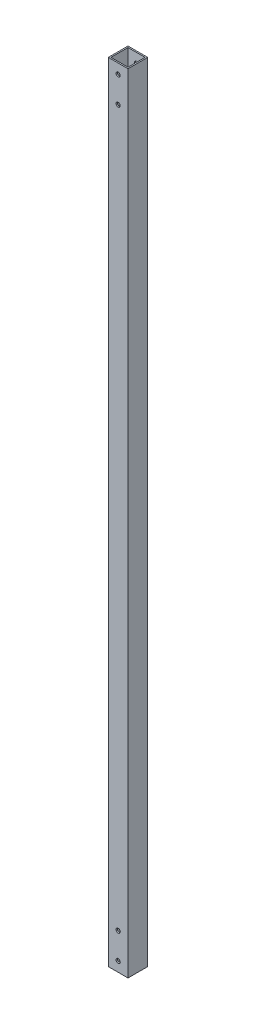
ISO-10303-21;
HEADER;
FILE_DESCRIPTION(('STEP AP214'),'2;1');
FILE_NAME('part.step','',(''),(''),'','','');
FILE_SCHEMA(('AUTOMOTIVE_DESIGN { 1 0 10303 214 1 1 1 1 }'));
ENDSEC;
DATA;
#1=APPLICATION_CONTEXT('core data for automotive mechanical design processes');
#2=APPLICATION_PROTOCOL_DEFINITION('international standard','automotive_design',2000,#1);
#3=PRODUCT_CONTEXT('',#1,'mechanical');
#4=PRODUCT('Part','Part','',(#3));
#5=PRODUCT_RELATED_PRODUCT_CATEGORY('part','',(#4));
#6=PRODUCT_DEFINITION_FORMATION('','',#4);
#7=PRODUCT_DEFINITION_CONTEXT('part definition',#1,'design');
#8=PRODUCT_DEFINITION('design','',#6,#7);
#9=PRODUCT_DEFINITION_SHAPE('','',#8);
#10=(LENGTH_UNIT() NAMED_UNIT(*) SI_UNIT(.MILLI.,.METRE.));
#11=(NAMED_UNIT(*) PLANE_ANGLE_UNIT() SI_UNIT($,.RADIAN.));
#12=(NAMED_UNIT(*) SI_UNIT($,.STERADIAN.) SOLID_ANGLE_UNIT());
#13=UNCERTAINTY_MEASURE_WITH_UNIT(LENGTH_MEASURE(1.E-05),#10,'distance_accuracy_value','');
#14=(GEOMETRIC_REPRESENTATION_CONTEXT(3) GLOBAL_UNCERTAINTY_ASSIGNED_CONTEXT((#13)) GLOBAL_UNIT_ASSIGNED_CONTEXT((#10,
#11,#12)) REPRESENTATION_CONTEXT('',''));
#15=CARTESIAN_POINT('',(0.,0.,0.));
#16=DIRECTION('',(0.,0.,1.));
#17=DIRECTION('',(1.,0.,0.));
#18=AXIS2_PLACEMENT_3D('',#15,#16,#17);
#19=CARTESIAN_POINT('',(0.,600.,0.));
#20=DIRECTION('',(0.,1.,0.));
#21=DIRECTION('',(0.,0.,1.));
#22=AXIS2_PLACEMENT_3D('',#19,#20,#21);
#23=PLANE('',#22);
#24=DIRECTION('',(0.,0.,-1.));
#25=VECTOR('',#24,1.);
#26=CARTESIAN_POINT('',(7.5,600.,7.5));
#27=LINE('',#26,#25);
#28=CARTESIAN_POINT('',(7.5,600.,7.5));
#29=VERTEX_POINT('',#28);
#30=CARTESIAN_POINT('',(7.5,600.,-7.5));
#31=VERTEX_POINT('',#30);
#32=EDGE_CURVE('E187',#29,#31,#27,.T.);
#33=ORIENTED_EDGE('',*,*,#32,.T.);
#34=DIRECTION('',(-1.,0.,0.));
#35=VECTOR('',#34,1.);
#36=CARTESIAN_POINT('',(-7.5,600.,-7.5));
#37=LINE('',#36,#35);
#38=CARTESIAN_POINT('',(-7.5,600.,-7.5));
#39=VERTEX_POINT('',#38);
#40=EDGE_CURVE('E191',#31,#39,#37,.T.);
#41=ORIENTED_EDGE('',*,*,#40,.T.);
#42=DIRECTION('',(0.,0.,1.));
#43=VECTOR('',#42,1.);
#44=CARTESIAN_POINT('',(-7.5,600.,7.5));
#45=LINE('',#44,#43);
#46=CARTESIAN_POINT('',(-7.5,600.,7.5));
#47=VERTEX_POINT('',#46);
#48=EDGE_CURVE('E195',#39,#47,#45,.T.);
#49=ORIENTED_EDGE('',*,*,#48,.T.);
#50=DIRECTION('',(1.,0.,0.));
#51=VECTOR('',#50,1.);
#52=CARTESIAN_POINT('',(-7.5,600.,7.5));
#53=LINE('',#52,#51);
#54=EDGE_CURVE('E198',#47,#29,#53,.T.);
#55=ORIENTED_EDGE('',*,*,#54,.T.);
#56=EDGE_LOOP('',(#33,#41,#49,#55));
#57=FACE_BOUND('',#56,.T.);
#58=DIRECTION('',(-1.,0.,0.));
#59=VECTOR('',#58,1.);
#60=CARTESIAN_POINT('',(0.,600.,-6.5));
#61=LINE('',#60,#59);
#62=CARTESIAN_POINT('',(6.5,600.,-6.5));
#63=VERTEX_POINT('',#62);
#64=CARTESIAN_POINT('',(-6.5,600.,-6.5));
#65=VERTEX_POINT('',#64);
#66=EDGE_CURVE('E146',#63,#65,#61,.T.);
#67=ORIENTED_EDGE('',*,*,#66,.F.);
#68=DIRECTION('',(0.,0.,-1.));
#69=VECTOR('',#68,1.);
#70=CARTESIAN_POINT('',(6.5,600.,0.));
#71=LINE('',#70,#69);
#72=CARTESIAN_POINT('',(6.5,600.,6.5));
#73=VERTEX_POINT('',#72);
#74=EDGE_CURVE('E137',#73,#63,#71,.T.);
#75=ORIENTED_EDGE('',*,*,#74,.F.);
#76=DIRECTION('',(1.,0.,0.));
#77=VECTOR('',#76,1.);
#78=CARTESIAN_POINT('',(0.,600.,6.5));
#79=LINE('',#78,#77);
#80=CARTESIAN_POINT('',(-6.5,600.,6.5));
#81=VERTEX_POINT('',#80);
#82=EDGE_CURVE('E163',#81,#73,#79,.T.);
#83=ORIENTED_EDGE('',*,*,#82,.F.);
#84=DIRECTION('',(0.,0.,1.));
#85=VECTOR('',#84,1.);
#86=CARTESIAN_POINT('',(-6.5,600.,0.));
#87=LINE('',#86,#85);
#88=EDGE_CURVE('E159',#65,#81,#87,.T.);
#89=ORIENTED_EDGE('',*,*,#88,.F.);
#90=EDGE_LOOP('',(#67,#75,#83,#89));
#91=FACE_BOUND('',#90,.T.);
#92=ADVANCED_FACE('F69',(#57,#91),#23,.T.);
#93=CARTESIAN_POINT('',(0.,0.,0.));
#94=DIRECTION('',(0.,1.,0.));
#95=DIRECTION('',(0.,0.,1.));
#96=AXIS2_PLACEMENT_3D('',#93,#94,#95);
#97=PLANE('',#96);
#98=DIRECTION('',(0.,0.,-1.));
#99=VECTOR('',#98,1.);
#100=CARTESIAN_POINT('',(7.5,0.,7.5));
#101=LINE('',#100,#99);
#102=CARTESIAN_POINT('',(7.5,0.,7.5));
#103=VERTEX_POINT('',#102);
#104=CARTESIAN_POINT('',(7.5,0.,-7.5));
#105=VERTEX_POINT('',#104);
#106=EDGE_CURVE('E155',#103,#105,#101,.T.);
#107=ORIENTED_EDGE('',*,*,#106,.F.);
#108=DIRECTION('',(1.,0.,0.));
#109=VECTOR('',#108,1.);
#110=CARTESIAN_POINT('',(-7.5,0.,7.5));
#111=LINE('',#110,#109);
#112=CARTESIAN_POINT('',(-7.5,0.,7.5));
#113=VERTEX_POINT('',#112);
#114=EDGE_CURVE('E192',#113,#103,#111,.T.);
#115=ORIENTED_EDGE('',*,*,#114,.F.);
#116=DIRECTION('',(0.,0.,1.));
#117=VECTOR('',#116,1.);
#118=CARTESIAN_POINT('',(-7.5,0.,7.5));
#119=LINE('',#118,#117);
#120=CARTESIAN_POINT('',(-7.5,0.,-7.5));
#121=VERTEX_POINT('',#120);
#122=EDGE_CURVE('E208',#121,#113,#119,.T.);
#123=ORIENTED_EDGE('',*,*,#122,.F.);
#124=DIRECTION('',(-1.,0.,0.));
#125=VECTOR('',#124,1.);
#126=CARTESIAN_POINT('',(-7.5,0.,-7.5));
#127=LINE('',#126,#125);
#128=EDGE_CURVE('E205',#105,#121,#127,.T.);
#129=ORIENTED_EDGE('',*,*,#128,.F.);
#130=EDGE_LOOP('',(#107,#115,#123,#129));
#131=FACE_BOUND('',#130,.T.);
#132=DIRECTION('',(0.,0.,-1.));
#133=VECTOR('',#132,1.);
#134=CARTESIAN_POINT('',(6.5,0.,0.));
#135=LINE('',#134,#133);
#136=CARTESIAN_POINT('',(6.5,0.,6.5));
#137=VERTEX_POINT('',#136);
#138=CARTESIAN_POINT('',(6.5,0.,-6.5));
#139=VERTEX_POINT('',#138);
#140=EDGE_CURVE('E95',#137,#139,#135,.T.);
#141=ORIENTED_EDGE('',*,*,#140,.T.);
#142=DIRECTION('',(-1.,0.,0.));
#143=VECTOR('',#142,1.);
#144=CARTESIAN_POINT('',(0.,0.,-6.5));
#145=LINE('',#144,#143);
#146=CARTESIAN_POINT('',(-6.5,0.,-6.5));
#147=VERTEX_POINT('',#146);
#148=EDGE_CURVE('E153',#139,#147,#145,.T.);
#149=ORIENTED_EDGE('',*,*,#148,.T.);
#150=DIRECTION('',(0.,0.,1.));
#151=VECTOR('',#150,1.);
#152=CARTESIAN_POINT('',(-6.5,0.,0.));
#153=LINE('',#152,#151);
#154=CARTESIAN_POINT('',(-6.5,0.,6.5));
#155=VERTEX_POINT('',#154);
#156=EDGE_CURVE('E174',#147,#155,#153,.T.);
#157=ORIENTED_EDGE('',*,*,#156,.T.);
#158=DIRECTION('',(1.,0.,0.));
#159=VECTOR('',#158,1.);
#160=CARTESIAN_POINT('',(0.,0.,6.5));
#161=LINE('',#160,#159);
#162=EDGE_CURVE('E147',#155,#137,#161,.T.);
#163=ORIENTED_EDGE('',*,*,#162,.T.);
#164=EDGE_LOOP('',(#141,#149,#157,#163));
#165=FACE_BOUND('',#164,.T.);
#166=ADVANCED_FACE('F272',(#131,#165),#97,.F.);
#167=CARTESIAN_POINT('',(7.5,600.,7.5));
#168=DIRECTION('',(-1.,0.,0.));
#169=DIRECTION('',(0.,0.,1.));
#170=AXIS2_PLACEMENT_3D('',#167,#168,#169);
#171=PLANE('',#170);
#172=ORIENTED_EDGE('',*,*,#106,.T.);
#173=DIRECTION('',(0.,-1.,0.));
#174=VECTOR('',#173,1.);
#175=CARTESIAN_POINT('',(7.5,600.,-7.5));
#176=LINE('',#175,#174);
#177=EDGE_CURVE('E12',#31,#105,#176,.T.);
#178=ORIENTED_EDGE('',*,*,#177,.F.);
#179=ORIENTED_EDGE('',*,*,#32,.F.);
#180=DIRECTION('',(0.,-1.,0.));
#181=VECTOR('',#180,1.);
#182=CARTESIAN_POINT('',(7.5,600.,7.5));
#183=LINE('',#182,#181);
#184=EDGE_CURVE('E201',#29,#103,#183,.T.);
#185=ORIENTED_EDGE('',*,*,#184,.T.);
#186=EDGE_LOOP('',(#172,#178,#179,#185));
#187=FACE_BOUND('',#186,.T.);
#188=ADVANCED_FACE('F71',(#187),#171,.F.);
#189=CARTESIAN_POINT('',(-7.5,600.,-7.5));
#190=DIRECTION('',(0.,0.,1.));
#191=DIRECTION('',(1.,0.,0.));
#192=AXIS2_PLACEMENT_3D('',#189,#190,#191);
#193=PLANE('',#192);
#194=CARTESIAN_POINT('',(0.,7.5,-7.5));
#195=DIRECTION('',(0.,0.,1.));
#196=DIRECTION('',(1.,0.,0.));
#197=AXIS2_PLACEMENT_3D('',#194,#195,#196);
#198=CIRCLE('',#197,1.6);
#199=CARTESIAN_POINT('',(1.6,7.5,-7.5));
#200=VERTEX_POINT('',#199);
#201=EDGE_CURVE('E228',#200,#200,#198,.T.);
#202=ORIENTED_EDGE('',*,*,#201,.T.);
#203=EDGE_LOOP('',(#202));
#204=FACE_BOUND('',#203,.T.);
#205=CARTESIAN_POINT('',(0.,27.5,-7.5));
#206=DIRECTION('',(0.,0.,1.));
#207=DIRECTION('',(1.,0.,0.));
#208=AXIS2_PLACEMENT_3D('',#205,#206,#207);
#209=CIRCLE('',#208,1.6);
#210=CARTESIAN_POINT('',(1.6,27.5,-7.5));
#211=VERTEX_POINT('',#210);
#212=EDGE_CURVE('E312',#211,#211,#209,.T.);
#213=ORIENTED_EDGE('',*,*,#212,.T.);
#214=EDGE_LOOP('',(#213));
#215=FACE_BOUND('',#214,.T.);
#216=CARTESIAN_POINT('',(0.,572.5,-7.5));
#217=DIRECTION('',(0.,0.,1.));
#218=DIRECTION('',(1.,0.,0.));
#219=AXIS2_PLACEMENT_3D('',#216,#217,#218);
#220=CIRCLE('',#219,1.60000000000004);
#221=CARTESIAN_POINT('',(1.60000000000004,572.5,-7.5));
#222=VERTEX_POINT('',#221);
#223=EDGE_CURVE('E316',#222,#222,#220,.T.);
#224=ORIENTED_EDGE('',*,*,#223,.T.);
#225=EDGE_LOOP('',(#224));
#226=FACE_BOUND('',#225,.T.);
#227=CARTESIAN_POINT('',(0.,592.5,-7.5));
#228=DIRECTION('',(0.,0.,1.));
#229=DIRECTION('',(1.,0.,0.));
#230=AXIS2_PLACEMENT_3D('',#227,#228,#229);
#231=CIRCLE('',#230,1.60000000000004);
#232=CARTESIAN_POINT('',(1.60000000000004,592.5,-7.5));
#233=VERTEX_POINT('',#232);
#234=EDGE_CURVE('E320',#233,#233,#231,.T.);
#235=ORIENTED_EDGE('',*,*,#234,.T.);
#236=EDGE_LOOP('',(#235));
#237=FACE_BOUND('',#236,.T.);
#238=ORIENTED_EDGE('',*,*,#128,.T.);
#239=DIRECTION('',(0.,-1.,0.));
#240=VECTOR('',#239,1.);
#241=CARTESIAN_POINT('',(-7.5,600.,-7.5));
#242=LINE('',#241,#240);
#243=EDGE_CURVE('E79',#39,#121,#242,.T.);
#244=ORIENTED_EDGE('',*,*,#243,.F.);
#245=ORIENTED_EDGE('',*,*,#40,.F.);
#246=ORIENTED_EDGE('',*,*,#177,.T.);
#247=EDGE_LOOP('',(#238,#244,#245,#246));
#248=FACE_BOUND('',#247,.T.);
#249=ADVANCED_FACE('F299',(#204,#215,#226,#237,#248),#193,.F.);
#250=CARTESIAN_POINT('',(-7.5,600.,7.5));
#251=DIRECTION('',(1.,0.,0.));
#252=DIRECTION('',(0.,0.,-1.));
#253=AXIS2_PLACEMENT_3D('',#250,#251,#252);
#254=PLANE('',#253);
#255=ORIENTED_EDGE('',*,*,#122,.T.);
#256=DIRECTION('',(0.,-1.,0.));
#257=VECTOR('',#256,1.);
#258=CARTESIAN_POINT('',(-7.5,600.,7.5));
#259=LINE('',#258,#257);
#260=EDGE_CURVE('E216',#47,#113,#259,.T.);
#261=ORIENTED_EDGE('',*,*,#260,.F.);
#262=ORIENTED_EDGE('',*,*,#48,.F.);
#263=ORIENTED_EDGE('',*,*,#243,.T.);
#264=EDGE_LOOP('',(#255,#261,#262,#263));
#265=FACE_BOUND('',#264,.T.);
#266=ADVANCED_FACE('F296',(#265),#254,.F.);
#267=CARTESIAN_POINT('',(-7.5,600.,7.5));
#268=DIRECTION('',(0.,0.,-1.));
#269=DIRECTION('',(-1.,0.,0.));
#270=AXIS2_PLACEMENT_3D('',#267,#268,#269);
#271=PLANE('',#270);
#272=CARTESIAN_POINT('',(0.,7.5,7.5));
#273=DIRECTION('',(0.,0.,1.));
#274=DIRECTION('',(1.,0.,0.));
#275=AXIS2_PLACEMENT_3D('',#272,#273,#274);
#276=CIRCLE('',#275,1.6);
#277=CARTESIAN_POINT('',(1.6,7.5,7.5));
#278=VERTEX_POINT('',#277);
#279=EDGE_CURVE('E351',#278,#278,#276,.T.);
#280=ORIENTED_EDGE('',*,*,#279,.F.);
#281=EDGE_LOOP('',(#280));
#282=FACE_BOUND('',#281,.T.);
#283=CARTESIAN_POINT('',(0.,27.5,7.5));
#284=DIRECTION('',(0.,0.,1.));
#285=DIRECTION('',(1.,0.,0.));
#286=AXIS2_PLACEMENT_3D('',#283,#284,#285);
#287=CIRCLE('',#286,1.6);
#288=CARTESIAN_POINT('',(1.6,27.5,7.5));
#289=VERTEX_POINT('',#288);
#290=EDGE_CURVE('E347',#289,#289,#287,.T.);
#291=ORIENTED_EDGE('',*,*,#290,.F.);
#292=EDGE_LOOP('',(#291));
#293=FACE_BOUND('',#292,.T.);
#294=CARTESIAN_POINT('',(0.,572.5,7.5));
#295=DIRECTION('',(0.,0.,1.));
#296=DIRECTION('',(1.,0.,0.));
#297=AXIS2_PLACEMENT_3D('',#294,#295,#296);
#298=CIRCLE('',#297,1.60000000000004);
#299=CARTESIAN_POINT('',(1.60000000000004,572.5,7.5));
#300=VERTEX_POINT('',#299);
#301=EDGE_CURVE('E341',#300,#300,#298,.T.);
#302=ORIENTED_EDGE('',*,*,#301,.F.);
#303=EDGE_LOOP('',(#302));
#304=FACE_BOUND('',#303,.T.);
#305=CARTESIAN_POINT('',(0.,592.5,7.5));
#306=DIRECTION('',(0.,0.,1.));
#307=DIRECTION('',(1.,0.,0.));
#308=AXIS2_PLACEMENT_3D('',#305,#306,#307);
#309=CIRCLE('',#308,1.60000000000004);
#310=CARTESIAN_POINT('',(1.60000000000004,592.5,7.5));
#311=VERTEX_POINT('',#310);
#312=EDGE_CURVE('E334',#311,#311,#309,.T.);
#313=ORIENTED_EDGE('',*,*,#312,.F.);
#314=EDGE_LOOP('',(#313));
#315=FACE_BOUND('',#314,.T.);
#316=ORIENTED_EDGE('',*,*,#114,.T.);
#317=ORIENTED_EDGE('',*,*,#184,.F.);
#318=ORIENTED_EDGE('',*,*,#54,.F.);
#319=ORIENTED_EDGE('',*,*,#260,.T.);
#320=EDGE_LOOP('',(#316,#317,#318,#319));
#321=FACE_BOUND('',#320,.T.);
#322=ADVANCED_FACE('F293',(#282,#293,#304,#315,#321),#271,.F.);
#323=CARTESIAN_POINT('',(6.5,600.,0.));
#324=DIRECTION('',(-1.,0.,0.));
#325=DIRECTION('',(0.,0.,1.));
#326=AXIS2_PLACEMENT_3D('',#323,#324,#325);
#327=PLANE('',#326);
#328=ORIENTED_EDGE('',*,*,#140,.F.);
#329=DIRECTION('',(0.,-1.,0.));
#330=VECTOR('',#329,1.);
#331=CARTESIAN_POINT('',(6.5,600.,6.5));
#332=LINE('',#331,#330);
#333=EDGE_CURVE('E141',#73,#137,#332,.T.);
#334=ORIENTED_EDGE('',*,*,#333,.F.);
#335=ORIENTED_EDGE('',*,*,#74,.T.);
#336=DIRECTION('',(0.,-1.,0.));
#337=VECTOR('',#336,1.);
#338=CARTESIAN_POINT('',(6.5,600.,-6.5));
#339=LINE('',#338,#337);
#340=EDGE_CURVE('E140',#63,#139,#339,.T.);
#341=ORIENTED_EDGE('',*,*,#340,.T.);
#342=EDGE_LOOP('',(#328,#334,#335,#341));
#343=FACE_BOUND('',#342,.T.);
#344=ADVANCED_FACE('F139',(#343),#327,.T.);
#345=CARTESIAN_POINT('',(0.,600.,-6.5));
#346=DIRECTION('',(0.,0.,1.));
#347=DIRECTION('',(1.,0.,0.));
#348=AXIS2_PLACEMENT_3D('',#345,#346,#347);
#349=PLANE('',#348);
#350=CARTESIAN_POINT('',(0.,7.5,-6.5));
#351=DIRECTION('',(0.,0.,1.));
#352=DIRECTION('',(1.,0.,0.));
#353=AXIS2_PLACEMENT_3D('',#350,#351,#352);
#354=CIRCLE('',#353,1.6);
#355=CARTESIAN_POINT('',(1.6,7.5,-6.5));
#356=VERTEX_POINT('',#355);
#357=EDGE_CURVE('E171',#356,#356,#354,.T.);
#358=ORIENTED_EDGE('',*,*,#357,.F.);
#359=EDGE_LOOP('',(#358));
#360=FACE_BOUND('',#359,.T.);
#361=CARTESIAN_POINT('',(0.,27.5,-6.5));
#362=DIRECTION('',(0.,0.,1.));
#363=DIRECTION('',(1.,0.,0.));
#364=AXIS2_PLACEMENT_3D('',#361,#362,#363);
#365=CIRCLE('',#364,1.6);
#366=CARTESIAN_POINT('',(1.6,27.5,-6.5));
#367=VERTEX_POINT('',#366);
#368=EDGE_CURVE('E236',#367,#367,#365,.T.);
#369=ORIENTED_EDGE('',*,*,#368,.F.);
#370=EDGE_LOOP('',(#369));
#371=FACE_BOUND('',#370,.T.);
#372=CARTESIAN_POINT('',(0.,572.5,-6.5));
#373=DIRECTION('',(0.,0.,1.));
#374=DIRECTION('',(1.,0.,0.));
#375=AXIS2_PLACEMENT_3D('',#372,#373,#374);
#376=CIRCLE('',#375,1.60000000000004);
#377=CARTESIAN_POINT('',(1.60000000000004,572.5,-6.5));
#378=VERTEX_POINT('',#377);
#379=EDGE_CURVE('E232',#378,#378,#376,.T.);
#380=ORIENTED_EDGE('',*,*,#379,.F.);
#381=EDGE_LOOP('',(#380));
#382=FACE_BOUND('',#381,.T.);
#383=CARTESIAN_POINT('',(0.,592.5,-6.5));
#384=DIRECTION('',(0.,0.,1.));
#385=DIRECTION('',(1.,0.,0.));
#386=AXIS2_PLACEMENT_3D('',#383,#384,#385);
#387=CIRCLE('',#386,1.60000000000004);
#388=CARTESIAN_POINT('',(1.60000000000004,592.5,-6.5));
#389=VERTEX_POINT('',#388);
#390=EDGE_CURVE('E227',#389,#389,#387,.T.);
#391=ORIENTED_EDGE('',*,*,#390,.F.);
#392=EDGE_LOOP('',(#391));
#393=FACE_BOUND('',#392,.T.);
#394=ORIENTED_EDGE('',*,*,#148,.F.);
#395=ORIENTED_EDGE('',*,*,#340,.F.);
#396=ORIENTED_EDGE('',*,*,#66,.T.);
#397=DIRECTION('',(0.,-1.,0.));
#398=VECTOR('',#397,1.);
#399=CARTESIAN_POINT('',(-6.5,600.,-6.5));
#400=LINE('',#399,#398);
#401=EDGE_CURVE('E156',#65,#147,#400,.T.);
#402=ORIENTED_EDGE('',*,*,#401,.T.);
#403=EDGE_LOOP('',(#394,#395,#396,#402));
#404=FACE_BOUND('',#403,.T.);
#405=ADVANCED_FACE('F150',(#360,#371,#382,#393,#404),#349,.T.);
#406=CARTESIAN_POINT('',(-6.5,600.,0.));
#407=DIRECTION('',(1.,0.,0.));
#408=DIRECTION('',(0.,0.,-1.));
#409=AXIS2_PLACEMENT_3D('',#406,#407,#408);
#410=PLANE('',#409);
#411=ORIENTED_EDGE('',*,*,#156,.F.);
#412=ORIENTED_EDGE('',*,*,#401,.F.);
#413=ORIENTED_EDGE('',*,*,#88,.T.);
#414=DIRECTION('',(0.,-1.,0.));
#415=VECTOR('',#414,1.);
#416=CARTESIAN_POINT('',(-6.5,600.,6.5));
#417=LINE('',#416,#415);
#418=EDGE_CURVE('E87',#81,#155,#417,.T.);
#419=ORIENTED_EDGE('',*,*,#418,.T.);
#420=EDGE_LOOP('',(#411,#412,#413,#419));
#421=FACE_BOUND('',#420,.T.);
#422=ADVANCED_FACE('F264',(#421),#410,.T.);
#423=CARTESIAN_POINT('',(0.,600.,6.5));
#424=DIRECTION('',(0.,0.,-1.));
#425=DIRECTION('',(-1.,0.,0.));
#426=AXIS2_PLACEMENT_3D('',#423,#424,#425);
#427=PLANE('',#426);
#428=CARTESIAN_POINT('',(0.,7.5,6.5));
#429=DIRECTION('',(0.,0.,-1.));
#430=DIRECTION('',(-1.,0.,0.));
#431=AXIS2_PLACEMENT_3D('',#428,#429,#430);
#432=CIRCLE('',#431,1.6);
#433=CARTESIAN_POINT('',(-1.6,7.5,6.5));
#434=VERTEX_POINT('',#433);
#435=EDGE_CURVE('E73',#434,#434,#432,.T.);
#436=ORIENTED_EDGE('',*,*,#435,.F.);
#437=EDGE_LOOP('',(#436));
#438=FACE_BOUND('',#437,.T.);
#439=CARTESIAN_POINT('',(0.,27.5,6.5));
#440=DIRECTION('',(0.,0.,-1.));
#441=DIRECTION('',(-1.,0.,0.));
#442=AXIS2_PLACEMENT_3D('',#439,#440,#441);
#443=CIRCLE('',#442,1.6);
#444=CARTESIAN_POINT('',(-1.6,27.5,6.5));
#445=VERTEX_POINT('',#444);
#446=EDGE_CURVE('E233',#445,#445,#443,.T.);
#447=ORIENTED_EDGE('',*,*,#446,.F.);
#448=EDGE_LOOP('',(#447));
#449=FACE_BOUND('',#448,.T.);
#450=CARTESIAN_POINT('',(0.,572.5,6.5));
#451=DIRECTION('',(0.,0.,-1.));
#452=DIRECTION('',(-1.,0.,0.));
#453=AXIS2_PLACEMENT_3D('',#450,#451,#452);
#454=CIRCLE('',#453,1.60000000000004);
#455=CARTESIAN_POINT('',(-1.60000000000004,572.5,6.5));
#456=VERTEX_POINT('',#455);
#457=EDGE_CURVE('E229',#456,#456,#454,.T.);
#458=ORIENTED_EDGE('',*,*,#457,.F.);
#459=EDGE_LOOP('',(#458));
#460=FACE_BOUND('',#459,.T.);
#461=CARTESIAN_POINT('',(0.,592.5,6.5));
#462=DIRECTION('',(0.,0.,-1.));
#463=DIRECTION('',(-1.,0.,0.));
#464=AXIS2_PLACEMENT_3D('',#461,#462,#463);
#465=CIRCLE('',#464,1.60000000000004);
#466=CARTESIAN_POINT('',(-1.60000000000004,592.5,6.5));
#467=VERTEX_POINT('',#466);
#468=EDGE_CURVE('E223',#467,#467,#465,.T.);
#469=ORIENTED_EDGE('',*,*,#468,.F.);
#470=EDGE_LOOP('',(#469));
#471=FACE_BOUND('',#470,.T.);
#472=ORIENTED_EDGE('',*,*,#162,.F.);
#473=ORIENTED_EDGE('',*,*,#418,.F.);
#474=ORIENTED_EDGE('',*,*,#82,.T.);
#475=ORIENTED_EDGE('',*,*,#333,.T.);
#476=EDGE_LOOP('',(#472,#473,#474,#475));
#477=FACE_BOUND('',#476,.T.);
#478=ADVANCED_FACE('F260',(#438,#449,#460,#471,#477),#427,.T.);
#479=CARTESIAN_POINT('',(0.,592.5,-7.5));
#480=DIRECTION('',(0.,0.,1.));
#481=DIRECTION('',(1.,0.,0.));
#482=AXIS2_PLACEMENT_3D('',#479,#480,#481);
#483=CYLINDRICAL_SURFACE('',#482,1.60000000000004);
#484=ORIENTED_EDGE('',*,*,#468,.T.);
#485=EDGE_LOOP('',(#484));
#486=FACE_BOUND('',#485,.T.);
#487=ORIENTED_EDGE('',*,*,#312,.T.);
#488=EDGE_LOOP('',(#487));
#489=FACE_BOUND('',#488,.T.);
#490=ADVANCED_FACE('F263',(#486,#489),#483,.F.);
#491=CARTESIAN_POINT('',(0.,572.5,-7.5));
#492=DIRECTION('',(0.,0.,1.));
#493=DIRECTION('',(1.,0.,0.));
#494=AXIS2_PLACEMENT_3D('',#491,#492,#493);
#495=CYLINDRICAL_SURFACE('',#494,1.60000000000004);
#496=ORIENTED_EDGE('',*,*,#457,.T.);
#497=EDGE_LOOP('',(#496));
#498=FACE_BOUND('',#497,.T.);
#499=ORIENTED_EDGE('',*,*,#301,.T.);
#500=EDGE_LOOP('',(#499));
#501=FACE_BOUND('',#500,.T.);
#502=ADVANCED_FACE('F371',(#498,#501),#495,.F.);
#503=CARTESIAN_POINT('',(0.,27.5,-7.5));
#504=DIRECTION('',(0.,0.,1.));
#505=DIRECTION('',(1.,0.,0.));
#506=AXIS2_PLACEMENT_3D('',#503,#504,#505);
#507=CYLINDRICAL_SURFACE('',#506,1.6);
#508=ORIENTED_EDGE('',*,*,#446,.T.);
#509=EDGE_LOOP('',(#508));
#510=FACE_BOUND('',#509,.T.);
#511=ORIENTED_EDGE('',*,*,#290,.T.);
#512=EDGE_LOOP('',(#511));
#513=FACE_BOUND('',#512,.T.);
#514=ADVANCED_FACE('F372',(#510,#513),#507,.F.);
#515=CARTESIAN_POINT('',(0.,7.5,-7.5));
#516=DIRECTION('',(0.,0.,1.));
#517=DIRECTION('',(1.,0.,0.));
#518=AXIS2_PLACEMENT_3D('',#515,#516,#517);
#519=CYLINDRICAL_SURFACE('',#518,1.6);
#520=ORIENTED_EDGE('',*,*,#435,.T.);
#521=EDGE_LOOP('',(#520));
#522=FACE_BOUND('',#521,.T.);
#523=ORIENTED_EDGE('',*,*,#279,.T.);
#524=EDGE_LOOP('',(#523));
#525=FACE_BOUND('',#524,.T.);
#526=ADVANCED_FACE('F257',(#522,#525),#519,.F.);
#527=ORIENTED_EDGE('',*,*,#390,.T.);
#528=EDGE_LOOP('',(#527));
#529=FACE_BOUND('',#528,.T.);
#530=ORIENTED_EDGE('',*,*,#234,.F.);
#531=EDGE_LOOP('',(#530));
#532=FACE_BOUND('',#531,.T.);
#533=ADVANCED_FACE('F360',(#529,#532),#483,.F.);
#534=ORIENTED_EDGE('',*,*,#379,.T.);
#535=EDGE_LOOP('',(#534));
#536=FACE_BOUND('',#535,.T.);
#537=ORIENTED_EDGE('',*,*,#223,.F.);
#538=EDGE_LOOP('',(#537));
#539=FACE_BOUND('',#538,.T.);
#540=ADVANCED_FACE('F363',(#536,#539),#495,.F.);
#541=ORIENTED_EDGE('',*,*,#368,.T.);
#542=EDGE_LOOP('',(#541));
#543=FACE_BOUND('',#542,.T.);
#544=ORIENTED_EDGE('',*,*,#212,.F.);
#545=EDGE_LOOP('',(#544));
#546=FACE_BOUND('',#545,.T.);
#547=ADVANCED_FACE('F369',(#543,#546),#507,.F.);
#548=ORIENTED_EDGE('',*,*,#357,.T.);
#549=EDGE_LOOP('',(#548));
#550=FACE_BOUND('',#549,.T.);
#551=ORIENTED_EDGE('',*,*,#201,.F.);
#552=EDGE_LOOP('',(#551));
#553=FACE_BOUND('',#552,.T.);
#554=ADVANCED_FACE('F374',(#550,#553),#519,.F.);
#555=CLOSED_SHELL('',(#92,#166,#188,#249,#266,#322,#344,#405,#422,#478,#490,#502,#514,#526,#533,
#540,#547,#554));
#556=MANIFOLD_SOLID_BREP('B2',#555);
#557=ADVANCED_BREP_SHAPE_REPRESENTATION('',(#18,#556),#14);
#558=SHAPE_DEFINITION_REPRESENTATION(#9,#557);
ENDSEC;
END-ISO-10303-21;
